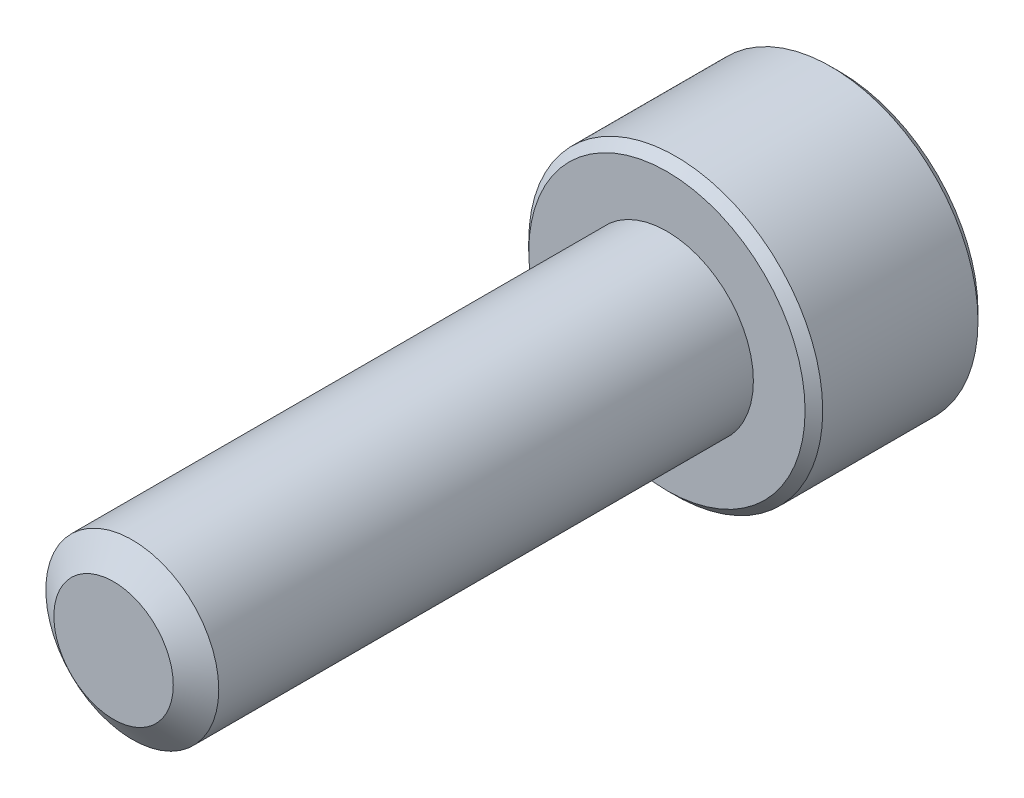
ISO-10303-21;
HEADER;
FILE_DESCRIPTION(('STEP AP214'),'2;1');
FILE_NAME('part.step','',(''),(''),'','','');
FILE_SCHEMA(('AUTOMOTIVE_DESIGN { 1 0 10303 214 1 1 1 1 }'));
ENDSEC;
DATA;
#1=APPLICATION_CONTEXT('core data for automotive mechanical design processes');
#2=APPLICATION_PROTOCOL_DEFINITION('international standard','automotive_design',2000,#1);
#3=PRODUCT_CONTEXT('',#1,'mechanical');
#4=PRODUCT('Part','Part','',(#3));
#5=PRODUCT_RELATED_PRODUCT_CATEGORY('part','',(#4));
#6=PRODUCT_DEFINITION_FORMATION('','',#4);
#7=PRODUCT_DEFINITION_CONTEXT('part definition',#1,'design');
#8=PRODUCT_DEFINITION('design','',#6,#7);
#9=PRODUCT_DEFINITION_SHAPE('','',#8);
#10=(LENGTH_UNIT() NAMED_UNIT(*) SI_UNIT(.MILLI.,.METRE.));
#11=(NAMED_UNIT(*) PLANE_ANGLE_UNIT() SI_UNIT($,.RADIAN.));
#12=(NAMED_UNIT(*) SI_UNIT($,.STERADIAN.) SOLID_ANGLE_UNIT());
#13=UNCERTAINTY_MEASURE_WITH_UNIT(LENGTH_MEASURE(1.E-05),#10,'distance_accuracy_value','');
#14=(GEOMETRIC_REPRESENTATION_CONTEXT(3) GLOBAL_UNCERTAINTY_ASSIGNED_CONTEXT((#13)) GLOBAL_UNIT_ASSIGNED_CONTEXT((#10,
#11,#12)) REPRESENTATION_CONTEXT('',''));
#15=CARTESIAN_POINT('',(0.,0.,0.));
#16=DIRECTION('',(0.,0.,1.));
#17=DIRECTION('',(1.,0.,0.));
#18=AXIS2_PLACEMENT_3D('',#15,#16,#17);
#19=CARTESIAN_POINT('',(0.,0.,-16.));
#20=DIRECTION('',(0.,0.,1.));
#21=DIRECTION('',(1.,0.,0.));
#22=AXIS2_PLACEMENT_3D('',#19,#20,#21);
#23=CYLINDRICAL_SURFACE('',#22,2.5);
#24=CARTESIAN_POINT('',(0.,0.,-0.541691224311848));
#25=DIRECTION('',(0.,0.,1.));
#26=DIRECTION('',(1.,0.,0.));
#27=AXIS2_PLACEMENT_3D('',#24,#25,#26);
#28=CIRCLE('',#27,2.5);
#29=CARTESIAN_POINT('',(2.5,0.,-0.541691224311848));
#30=VERTEX_POINT('',#29);
#31=EDGE_CURVE('E91',#30,#30,#28,.T.);
#32=ORIENTED_EDGE('',*,*,#31,.F.);
#33=EDGE_LOOP('',(#32));
#34=FACE_BOUND('',#33,.T.);
#35=CARTESIAN_POINT('',(0.,0.,-16.));
#36=DIRECTION('',(0.,0.,-1.));
#37=DIRECTION('',(-1.,0.,0.));
#38=AXIS2_PLACEMENT_3D('',#35,#36,#37);
#39=CIRCLE('',#38,2.5);
#40=CARTESIAN_POINT('',(-2.5,0.,-16.));
#41=VERTEX_POINT('',#40);
#42=EDGE_CURVE('E198',#41,#41,#39,.F.);
#43=ORIENTED_EDGE('',*,*,#42,.T.);
#44=EDGE_LOOP('',(#43));
#45=FACE_BOUND('',#44,.T.);
#46=ADVANCED_FACE('F17',(#34,#45),#23,.T.);
#47=CARTESIAN_POINT('',(0.,0.,0.));
#48=DIRECTION('',(0.,0.,-1.));
#49=DIRECTION('',(-1.,0.,0.));
#50=AXIS2_PLACEMENT_3D('',#47,#48,#49);
#51=CONICAL_SURFACE('',#50,1.72638475772933,0.959931088596884);
#52=ORIENTED_EDGE('',*,*,#31,.T.);
#53=EDGE_LOOP('',(#52));
#54=FACE_BOUND('',#53,.T.);
#55=CARTESIAN_POINT('',(0.,0.,0.));
#56=DIRECTION('',(0.,0.,1.));
#57=DIRECTION('',(1.,0.,0.));
#58=AXIS2_PLACEMENT_3D('',#55,#56,#57);
#59=CIRCLE('',#58,1.72638475772933);
#60=CARTESIAN_POINT('',(1.72638475772933,0.,0.));
#61=VERTEX_POINT('',#60);
#62=EDGE_CURVE('E196',#61,#61,#59,.T.);
#63=ORIENTED_EDGE('',*,*,#62,.F.);
#64=EDGE_LOOP('',(#63));
#65=FACE_BOUND('',#64,.T.);
#66=ADVANCED_FACE('F179',(#54,#65),#51,.T.);
#67=CARTESIAN_POINT('',(0.,0.,0.));
#68=DIRECTION('',(0.,0.,1.));
#69=DIRECTION('',(1.,0.,0.));
#70=AXIS2_PLACEMENT_3D('',#67,#68,#69);
#71=PLANE('',#70);
#72=ORIENTED_EDGE('',*,*,#62,.T.);
#73=EDGE_LOOP('',(#72));
#74=FACE_BOUND('',#73,.T.);
#75=ADVANCED_FACE('F176',(#74),#71,.T.);
#76=CARTESIAN_POINT('',(0.,0.,-21.));
#77=DIRECTION('',(0.,0.,1.));
#78=DIRECTION('',(1.,0.,0.));
#79=AXIS2_PLACEMENT_3D('',#76,#77,#78);
#80=CYLINDRICAL_SURFACE('',#79,4.25);
#81=CARTESIAN_POINT('',(0.,0.,-20.745));
#82=DIRECTION('',(0.,0.,-1.));
#83=DIRECTION('',(-1.,0.,0.));
#84=AXIS2_PLACEMENT_3D('',#81,#82,#83);
#85=CIRCLE('',#84,4.25);
#86=CARTESIAN_POINT('',(-4.25,0.,-20.745));
#87=VERTEX_POINT('',#86);
#88=EDGE_CURVE('E25',#87,#87,#85,.F.);
#89=ORIENTED_EDGE('',*,*,#88,.T.);
#90=EDGE_LOOP('',(#89));
#91=FACE_BOUND('',#90,.T.);
#92=CARTESIAN_POINT('',(0.,0.,-16.255));
#93=DIRECTION('',(0.,0.,-1.));
#94=DIRECTION('',(-1.,0.,0.));
#95=AXIS2_PLACEMENT_3D('',#92,#93,#94);
#96=CIRCLE('',#95,4.25);
#97=CARTESIAN_POINT('',(-4.25,0.,-16.255));
#98=VERTEX_POINT('',#97);
#99=EDGE_CURVE('E154',#98,#98,#96,.T.);
#100=ORIENTED_EDGE('',*,*,#99,.T.);
#101=EDGE_LOOP('',(#100));
#102=FACE_BOUND('',#101,.T.);
#103=ADVANCED_FACE('F159',(#91,#102),#80,.T.);
#104=CARTESIAN_POINT('',(0.,0.,-21.));
#105=DIRECTION('',(0.,0.,-1.));
#106=DIRECTION('',(-1.,0.,0.));
#107=AXIS2_PLACEMENT_3D('',#104,#105,#106);
#108=PLANE('',#107);
#109=CARTESIAN_POINT('',(0.,0.,-21.));
#110=DIRECTION('',(0.,0.,-1.));
#111=DIRECTION('',(-1.,0.,0.));
#112=AXIS2_PLACEMENT_3D('',#109,#110,#111);
#113=CIRCLE('',#112,3.995);
#114=CARTESIAN_POINT('',(-3.995,0.,-21.));
#115=VERTEX_POINT('',#114);
#116=EDGE_CURVE('E90',#115,#115,#113,.T.);
#117=ORIENTED_EDGE('',*,*,#116,.T.);
#118=EDGE_LOOP('',(#117));
#119=FACE_BOUND('',#118,.T.);
#120=CARTESIAN_POINT('',(0.,0.,-21.));
#121=DIRECTION('',(0.,0.,-1.));
#122=DIRECTION('',(-1.,0.,0.));
#123=AXIS2_PLACEMENT_3D('',#120,#121,#122);
#124=CIRCLE('',#123,2.3094010767585);
#125=CARTESIAN_POINT('',(-2.,1.15470053837925,-21.));
#126=VERTEX_POINT('',#125);
#127=CARTESIAN_POINT('',(0.,2.3094010767585,-21.));
#128=VERTEX_POINT('',#127);
#129=EDGE_CURVE('E71',#126,#128,#124,.T.);
#130=ORIENTED_EDGE('',*,*,#129,.F.);
#131=CARTESIAN_POINT('',(-2.,-1.15470053837925,-21.));
#132=VERTEX_POINT('',#131);
#133=EDGE_CURVE('E31',#132,#126,#124,.T.);
#134=ORIENTED_EDGE('',*,*,#133,.F.);
#135=CARTESIAN_POINT('',(0.,-2.3094010767585,-21.));
#136=VERTEX_POINT('',#135);
#137=EDGE_CURVE('E258',#136,#132,#124,.T.);
#138=ORIENTED_EDGE('',*,*,#137,.F.);
#139=CARTESIAN_POINT('',(2.,-1.15470053837925,-21.));
#140=VERTEX_POINT('',#139);
#141=EDGE_CURVE('E38',#140,#136,#124,.T.);
#142=ORIENTED_EDGE('',*,*,#141,.F.);
#143=CARTESIAN_POINT('',(2.,1.15470053837925,-21.));
#144=VERTEX_POINT('',#143);
#145=EDGE_CURVE('E112',#144,#140,#124,.T.);
#146=ORIENTED_EDGE('',*,*,#145,.F.);
#147=EDGE_CURVE('E80',#128,#144,#124,.T.);
#148=ORIENTED_EDGE('',*,*,#147,.F.);
#149=EDGE_LOOP('',(#130,#134,#138,#142,#146,#148));
#150=FACE_BOUND('',#149,.T.);
#151=ADVANCED_FACE('F111',(#119,#150),#108,.T.);
#152=CARTESIAN_POINT('',(0.,0.,-16.));
#153=DIRECTION('',(0.,0.,-1.));
#154=DIRECTION('',(-1.,0.,0.));
#155=AXIS2_PLACEMENT_3D('',#152,#153,#154);
#156=PLANE('',#155);
#157=CARTESIAN_POINT('',(0.,0.,-16.));
#158=DIRECTION('',(0.,0.,-1.));
#159=DIRECTION('',(-1.,0.,0.));
#160=AXIS2_PLACEMENT_3D('',#157,#158,#159);
#161=CIRCLE('',#160,3.995);
#162=CARTESIAN_POINT('',(-3.995,0.,-16.));
#163=VERTEX_POINT('',#162);
#164=EDGE_CURVE('E11',#163,#163,#161,.F.);
#165=ORIENTED_EDGE('',*,*,#164,.T.);
#166=EDGE_LOOP('',(#165));
#167=FACE_BOUND('',#166,.T.);
#168=ORIENTED_EDGE('',*,*,#42,.F.);
#169=EDGE_LOOP('',(#168));
#170=FACE_BOUND('',#169,.T.);
#171=ADVANCED_FACE('F168',(#167,#170),#156,.F.);
#172=CARTESIAN_POINT('',(0.,0.,-21.));
#173=DIRECTION('',(0.,0.,-1.));
#174=DIRECTION('',(-1.,0.,0.));
#175=AXIS2_PLACEMENT_3D('',#172,#173,#174);
#176=CONICAL_SURFACE('',#175,2.3094010767585,0.78539816339745);
#177=ORIENTED_EDGE('',*,*,#147,.T.);
#178=CARTESIAN_POINT('',(-0.000199999999999218,2.30951654681234,-21.0001154787137));
#179=CARTESIAN_POINT('',(0.0685530340307063,2.26982196410711,-20.9604530902256));
#180=CARTESIAN_POINT('',(0.138455742135513,2.22946361676572,-20.9231199822842));
#181=CARTESIAN_POINT('',(0.280995244550438,2.1471683966763,-20.8547636851361));
#182=CARTESIAN_POINT('',(0.353645597565359,2.10522369580642,-20.8237785337372));
#183=CARTESIAN_POINT('',(0.500141601053972,2.02064418875706,-20.7707002165441));
#184=CARTESIAN_POINT('',(0.573949935246294,1.97803092714269,-20.7484736271766));
#185=CARTESIAN_POINT('',(0.723191631835263,1.89186619344273,-20.7142288166751));
#186=CARTESIAN_POINT('',(0.798620433918151,1.84831735425552,-20.7021850291441));
#187=CARTESIAN_POINT('',(0.928615500671078,1.7732646674724,-20.6913185119056));
#188=CARTESIAN_POINT('',(0.983013783970108,1.74185780396625,-20.68970975361));
#189=CARTESIAN_POINT('',(1.09172145551969,1.67909540053412,-20.6924188775987));
#190=CARTESIAN_POINT('',(1.14603080592134,1.64773988246021,-20.696738837758));
#191=CARTESIAN_POINT('',(1.25413672758934,1.5853248994842,-20.7110595674099));
#192=CARTESIAN_POINT('',(1.30793265655479,1.55426580541469,-20.721066692762));
#193=CARTESIAN_POINT('',(1.41459426230557,1.49268469862228,-20.7462124302497));
#194=CARTESIAN_POINT('',(1.46746001007071,1.46216264491917,-20.7613506490422));
#195=CARTESIAN_POINT('',(1.60287973308984,1.38397803138049,-20.8062945034292));
#196=CARTESIAN_POINT('',(1.68459383484948,1.33680037273297,-20.8394888394258));
#197=CARTESIAN_POINT('',(1.8047470372578,1.26742988897853,-20.8955258231714));
#198=CARTESIAN_POINT('',(1.84434285210918,1.24456923461531,-20.9152147029469));
#199=CARTESIAN_POINT('',(1.92280095888787,1.19927142554652,-20.9563873183649));
#200=CARTESIAN_POINT('',(1.96166368359374,1.17683402097614,-20.9778699516512));
#201=CARTESIAN_POINT('',(2.0002,1.15458506832541,-21.0001154787137));
#202=B_SPLINE_CURVE_WITH_KNOTS('',3,(#178,#179,#180,#181,#182,#183,#184,#185,#186,#187,#188,
#189,#190,#191,#192,#193,#194,#195,#196,#197,#198,#199,#200,#201),.UNSPECIFIED.,.F.,.F.,(4,2,2,
2,2,2,2,2,2,2,2,4),(0.,0.266420613771064,0.534393751523387,0.798110374376912,1.06116288956936,
1.24939906803721,1.43770123566247,1.62621426093931,1.81471283831913,2.11415604834144,
2.2634717071779,2.41269626969771),.UNSPECIFIED.);
#203=EDGE_CURVE('E85',#128,#144,#202,.T.);
#204=ORIENTED_EDGE('',*,*,#203,.F.);
#205=EDGE_LOOP('',(#177,#204));
#206=FACE_BOUND('',#205,.T.);
#207=ADVANCED_FACE('F86',(#206),#176,.F.);
#208=ORIENTED_EDGE('',*,*,#145,.T.);
#209=CARTESIAN_POINT('',(2.,-2.30294417292923,-21.7407713550277));
#210=CARTESIAN_POINT('',(2.,-2.24687002663712,-21.698443273626));
#211=CARTESIAN_POINT('',(2.,-2.19048190536959,-21.6565251568643));
#212=CARTESIAN_POINT('',(2.,-2.07695390496424,-21.573690417861));
#213=CARTESIAN_POINT('',(2.,-2.01981384066454,-21.5327740496681));
#214=CARTESIAN_POINT('',(2.,-1.90424016804775,-21.4518334520186));
#215=CARTESIAN_POINT('',(2.,-1.84579996743909,-21.4118185915599));
#216=CARTESIAN_POINT('',(2.,-1.7279274546176,-21.3332889936643));
#217=CARTESIAN_POINT('',(2.,-1.66849521292323,-21.2947741502431));
#218=CARTESIAN_POINT('',(2.,-1.4816299571002,-21.1776406516043));
#219=CARTESIAN_POINT('',(2.,-1.35220318163536,-21.1021459017296));
#220=CARTESIAN_POINT('',(2.,-1.08689521592924,-20.9640493509944));
#221=CARTESIAN_POINT('',(2.,-0.951037763938189,-20.9014040859035));
#222=CARTESIAN_POINT('',(2.,-0.747111912259408,-20.8247635438751));
#223=CARTESIAN_POINT('',(2.,-0.682064034147876,-20.8027671799191));
#224=CARTESIAN_POINT('',(2.,-0.550398103294753,-20.7639966876601));
#225=CARTESIAN_POINT('',(2.,-0.483779942722476,-20.7472229191212));
#226=CARTESIAN_POINT('',(2.,-0.350484328847655,-20.7200482578844));
#227=CARTESIAN_POINT('',(2.,-0.283829489364786,-20.7095381767417));
#228=CARTESIAN_POINT('',(2.,-0.149806987139377,-20.6950960855449));
#229=CARTESIAN_POINT('',(2.,-0.0824394489341226,-20.6911629447331));
#230=CARTESIAN_POINT('',(2.,0.0499055622944889,-20.6901664769337));
#231=CARTESIAN_POINT('',(2.,0.114881285143171,-20.6928596448504));
#232=CARTESIAN_POINT('',(2.,0.24427592148276,-20.7044300704227));
#233=CARTESIAN_POINT('',(2.,0.308694780266753,-20.7133079288332));
#234=CARTESIAN_POINT('',(2.,0.437599788610704,-20.7369136592961));
#235=CARTESIAN_POINT('',(2.,0.502067428644594,-20.7517410834465));
#236=CARTESIAN_POINT('',(2.,0.629594322598305,-20.786457883628));
#237=CARTESIAN_POINT('',(2.,0.692653693883149,-20.8063468361063));
#238=CARTESIAN_POINT('',(2.,0.891187889210542,-20.8764469792562));
#239=CARTESIAN_POINT('',(2.,1.02383545707306,-20.9346418003215));
#240=CARTESIAN_POINT('',(2.,1.28290932150074,-21.0640305754596));
#241=CARTESIAN_POINT('',(2.,1.4093111258757,-21.1352712314148));
#242=CARTESIAN_POINT('',(2.,1.59200441438962,-21.2464419918747));
#243=CARTESIAN_POINT('',(2.,1.6502754902619,-21.2831821903374));
#244=CARTESIAN_POINT('',(2.,1.76581760389242,-21.3582145141838));
#245=CARTESIAN_POINT('',(2.,1.82308856543104,-21.396506757118));
#246=CARTESIAN_POINT('',(2.,1.93629654762083,-21.4740422640812));
#247=CARTESIAN_POINT('',(2.,1.99224062500538,-21.5132752761336));
#248=CARTESIAN_POINT('',(2.,2.10336424029899,-21.5927788307365));
#249=CARTESIAN_POINT('',(2.,2.15854398422467,-21.6330490850006));
#250=CARTESIAN_POINT('',(2.,2.21340370692658,-21.6737442381459));
#251=B_SPLINE_CURVE_WITH_KNOTS('',3,(#209,#210,#211,#212,#213,#214,#215,#216,#217,#218,#219,
#220,#221,#222,#223,#224,#225,#226,#227,#228,#229,#230,#231,#232,#233,#234,#235,#236,#237,#238,
#239,#240,#241,#242,#243,#244,#245,#246,#247,#248,#249,#250),.UNSPECIFIED.,.F.,.F.,(4,2,2,2,2,2,
2,2,2,2,2,2,2,2,2,2,2,2,2,2,4),(0.,0.210772731976891,0.42159837465859,0.634057554623492,
0.846501695870172,1.29562155455624,1.74319622821645,1.94902062110207,2.15485918928325,
2.35699582502635,2.5590977043214,2.75388435553556,2.94868993014815,3.14690093452585,
3.34509535789702,3.77838155837653,4.21325029921624,4.41989056685646,4.6265465146092,
4.83152377111288,5.03644465914084),.UNSPECIFIED.);
#252=EDGE_CURVE('E79',#144,#140,#251,.F.);
#253=ORIENTED_EDGE('',*,*,#252,.F.);
#254=EDGE_LOOP('',(#208,#253));
#255=FACE_BOUND('',#254,.T.);
#256=ADVANCED_FACE('F264',(#255),#176,.F.);
#257=ORIENTED_EDGE('',*,*,#141,.T.);
#258=CARTESIAN_POINT('',(2.0002,-1.15458506832541,-21.0001154787137));
#259=CARTESIAN_POINT('',(1.93144696596929,-1.19427965103065,-20.9604530902256));
#260=CARTESIAN_POINT('',(1.86154425786449,-1.23463799837204,-20.9231199822842));
#261=CARTESIAN_POINT('',(1.71900475544956,-1.31693321846145,-20.8547636851361));
#262=CARTESIAN_POINT('',(1.64635440243464,-1.35887791933134,-20.8237785337372));
#263=CARTESIAN_POINT('',(1.49985839894603,-1.44345742638069,-20.7707002165441));
#264=CARTESIAN_POINT('',(1.42605006475371,-1.48607068799507,-20.7484736271766));
#265=CARTESIAN_POINT('',(1.27680836816474,-1.57223542169503,-20.7142288166751));
#266=CARTESIAN_POINT('',(1.20137956608185,-1.61578426088223,-20.7021850291441));
#267=CARTESIAN_POINT('',(1.07138449932892,-1.69083694766536,-20.6913185119056));
#268=CARTESIAN_POINT('',(1.01698621602989,-1.72224381117151,-20.68970975361));
#269=CARTESIAN_POINT('',(0.908278544480308,-1.78500621460364,-20.6924188775987));
#270=CARTESIAN_POINT('',(0.853969194078662,-1.81636173267754,-20.696738837758));
#271=CARTESIAN_POINT('',(0.745863272410664,-1.87877671565355,-20.7110595674099));
#272=CARTESIAN_POINT('',(0.69206734344521,-1.90983580972306,-20.721066692762));
#273=CARTESIAN_POINT('',(0.585405737694428,-1.97141691651547,-20.7462124302497));
#274=CARTESIAN_POINT('',(0.532539989929289,-2.00193897021859,-20.7613506490422));
#275=CARTESIAN_POINT('',(0.397120266910157,-2.08012358375727,-20.8062945034292));
#276=CARTESIAN_POINT('',(0.315406165150522,-2.12730124240478,-20.8394888394258));
#277=CARTESIAN_POINT('',(0.195252962742197,-2.19667172615922,-20.8955258231714));
#278=CARTESIAN_POINT('',(0.155657147890822,-2.21953238052245,-20.9152147029469));
#279=CARTESIAN_POINT('',(0.0771990411121272,-2.26483018959124,-20.9563873183649));
#280=CARTESIAN_POINT('',(0.0383363164062592,-2.28726759416161,-20.9778699516512));
#281=CARTESIAN_POINT('',(-0.000199999999999639,-2.30951654681234,-21.0001154787137));
#282=B_SPLINE_CURVE_WITH_KNOTS('',3,(#258,#259,#260,#261,#262,#263,#264,#265,#266,#267,#268,
#269,#270,#271,#272,#273,#274,#275,#276,#277,#278,#279,#280,#281),.UNSPECIFIED.,.F.,.F.,(4,2,2,
2,2,2,2,2,2,2,2,4),(0.,0.266420613771064,0.534393751523389,0.798110374376914,1.06116288956936,
1.24939906803722,1.43770123566247,1.62621426093931,1.81471283831913,2.11415604834145,
2.26347170717791,2.41269626969771),.UNSPECIFIED.);
#283=EDGE_CURVE('E122',#140,#136,#282,.T.);
#284=ORIENTED_EDGE('',*,*,#283,.F.);
#285=EDGE_LOOP('',(#257,#284));
#286=FACE_BOUND('',#285,.T.);
#287=ADVANCED_FACE('F261',(#286),#176,.F.);
#288=ORIENTED_EDGE('',*,*,#137,.T.);
#289=CARTESIAN_POINT('',(0.000200000000000452,-2.30951654681234,-21.0001154787137));
#290=CARTESIAN_POINT('',(-0.0685530340307053,-2.26982196410711,-20.9604530902256));
#291=CARTESIAN_POINT('',(-0.138455742135511,-2.22946361676572,-20.9231199822842));
#292=CARTESIAN_POINT('',(-0.280995244550436,-2.1471683966763,-20.8547636851361));
#293=CARTESIAN_POINT('',(-0.353645597565357,-2.10522369580642,-20.8237785337372));
#294=CARTESIAN_POINT('',(-0.50014160105397,-2.02064418875706,-20.7707002165441));
#295=CARTESIAN_POINT('',(-0.573949935246293,-1.97803092714269,-20.7484736271766));
#296=CARTESIAN_POINT('',(-0.723191631835262,-1.89186619344273,-20.7142288166751));
#297=CARTESIAN_POINT('',(-0.79862043391815,-1.84831735425552,-20.7021850291441));
#298=CARTESIAN_POINT('',(-0.928615500671077,-1.7732646674724,-20.6913185119056));
#299=CARTESIAN_POINT('',(-0.983013783970106,-1.74185780396625,-20.68970975361));
#300=CARTESIAN_POINT('',(-1.09172145551969,-1.67909540053412,-20.6924188775987));
#301=CARTESIAN_POINT('',(-1.14603080592134,-1.64773988246022,-20.696738837758));
#302=CARTESIAN_POINT('',(-1.25413672758934,-1.5853248994842,-20.7110595674099));
#303=CARTESIAN_POINT('',(-1.30793265655479,-1.55426580541469,-20.721066692762));
#304=CARTESIAN_POINT('',(-1.41459426230557,-1.49268469862228,-20.7462124302497));
#305=CARTESIAN_POINT('',(-1.46746001007071,-1.46216264491917,-20.7613506490422));
#306=CARTESIAN_POINT('',(-1.60287973308984,-1.38397803138049,-20.8062945034292));
#307=CARTESIAN_POINT('',(-1.68459383484948,-1.33680037273297,-20.8394888394258));
#308=CARTESIAN_POINT('',(-1.8047470372578,-1.26742988897853,-20.8955258231714));
#309=CARTESIAN_POINT('',(-1.84434285210918,-1.24456923461531,-20.9152147029469));
#310=CARTESIAN_POINT('',(-1.92280095888787,-1.19927142554652,-20.9563873183649));
#311=CARTESIAN_POINT('',(-1.96166368359374,-1.17683402097614,-20.9778699516513));
#312=CARTESIAN_POINT('',(-2.0002,-1.15458506832541,-21.0001154787137));
#313=B_SPLINE_CURVE_WITH_KNOTS('',3,(#289,#290,#291,#292,#293,#294,#295,#296,#297,#298,#299,
#300,#301,#302,#303,#304,#305,#306,#307,#308,#309,#310,#311,#312),.UNSPECIFIED.,.F.,.F.,(4,2,2,
2,2,2,2,2,2,2,2,4),(0.,0.266420613771063,0.534393751523388,0.798110374376913,1.06116288956936,
1.24939906803721,1.43770123566247,1.62621426093931,1.81471283831913,2.11415604834145,
2.26347170717791,2.41269626969771),.UNSPECIFIED.);
#314=EDGE_CURVE('E235',#136,#132,#313,.T.);
#315=ORIENTED_EDGE('',*,*,#314,.F.);
#316=EDGE_LOOP('',(#288,#315));
#317=FACE_BOUND('',#316,.T.);
#318=ADVANCED_FACE('F260',(#317),#176,.F.);
#319=ORIENTED_EDGE('',*,*,#133,.T.);
#320=CARTESIAN_POINT('',(-2.,-2.3029441732643,-21.7407713552807));
#321=CARTESIAN_POINT('',(-2.,-2.24687002696278,-21.6984432738692));
#322=CARTESIAN_POINT('',(-2.,-2.19048190568582,-21.6565251570978));
#323=CARTESIAN_POINT('',(-2.,-2.07695390526152,-21.5736904180751));
#324=CARTESIAN_POINT('',(-2.,-2.01981384095229,-21.5327740498725));
#325=CARTESIAN_POINT('',(-2.,-1.90424016831614,-21.4518334522036));
#326=CARTESIAN_POINT('',(-2.,-1.84579996769763,-21.4118185917352));
#327=CARTESIAN_POINT('',(-2.,-1.72792745485625,-21.3332889938203));
#328=CARTESIAN_POINT('',(-2.,-1.66849521315186,-21.2947741503895));
#329=CARTESIAN_POINT('',(-2.,-1.48162995729573,-21.1776406517203));
#330=CARTESIAN_POINT('',(-2.,-1.35220318180736,-21.1021459018253));
#331=CARTESIAN_POINT('',(-2.,-1.08689521605219,-20.9640493510523));
#332=CARTESIAN_POINT('',(-2.,-0.951037764035626,-20.901404085944));
#333=CARTESIAN_POINT('',(-2.,-0.747111912337647,-20.8247635439028));
#334=CARTESIAN_POINT('',(-2.,-0.682064034234152,-20.8027671799472));
#335=CARTESIAN_POINT('',(-2.,-0.550398103397368,-20.7639966876876));
#336=CARTESIAN_POINT('',(-2.,-0.483779942833393,-20.7472229191476));
#337=CARTESIAN_POINT('',(-2.,-0.3504843289749,-20.7200482579067));
#338=CARTESIAN_POINT('',(-2.,-0.283829489500055,-20.709538176761));
#339=CARTESIAN_POINT('',(-2.,-0.149806987290425,-20.6950960855565));
#340=CARTESIAN_POINT('',(-2.,-0.0824394490929252,-20.6911629447399));
#341=CARTESIAN_POINT('',(-2.,0.0499055621213777,-20.6901664769296));
#342=CARTESIAN_POINT('',(-2.,0.114881284963487,-20.6928596448403));
#343=CARTESIAN_POINT('',(-2.,0.244275921290586,-20.7044300703996));
#344=CARTESIAN_POINT('',(-2.,0.308694780068663,-20.7133079288031));
#345=CARTESIAN_POINT('',(-2.,0.437599788400936,-20.7369136592514));
#346=CARTESIAN_POINT('',(-2.,0.502067428429081,-20.7517410833941));
#347=CARTESIAN_POINT('',(-2.,0.629594322371857,-20.78645788356));
#348=CARTESIAN_POINT('',(-2.,0.692653693651511,-20.8063468360305));
#349=CARTESIAN_POINT('',(-2.,0.891187888928466,-20.8764469791434));
#350=CARTESIAN_POINT('',(-2.,1.02383545674826,-20.9346418001747));
#351=CARTESIAN_POINT('',(-2.,1.28290932109378,-21.0640305752409));
#352=CARTESIAN_POINT('',(-2.,1.40931112542932,-21.1352712311583));
#353=CARTESIAN_POINT('',(-2.,1.59200441388854,-21.2464419915627));
#354=CARTESIAN_POINT('',(-2.,1.65027548974481,-21.2831821900083));
#355=CARTESIAN_POINT('',(-2.,1.76581760334354,-21.3582145138205));
#356=CARTESIAN_POINT('',(-2.,1.82308856486638,-21.3965067567377));
#357=CARTESIAN_POINT('',(-2.,1.936296547025,-21.4740422636668));
#358=CARTESIAN_POINT('',(-2.,1.99224062439414,-21.5132752757022));
#359=CARTESIAN_POINT('',(-2.,2.10336423965705,-21.5927788302713));
#360=CARTESIAN_POINT('',(-2.,2.15854398356743,-21.6330490845185));
#361=CARTESIAN_POINT('',(-2.,2.21340370625406,-21.673744237647));
#362=B_SPLINE_CURVE_WITH_KNOTS('',3,(#320,#321,#322,#323,#324,#325,#326,#327,#328,#329,#330,
#331,#332,#333,#334,#335,#336,#337,#338,#339,#340,#341,#342,#343,#344,#345,#346,#347,#348,#349,
#350,#351,#352,#353,#354,#355,#356,#357,#358,#359,#360,#361),.UNSPECIFIED.,.F.,.F.,(4,2,2,2,2,2,
2,2,2,2,2,2,2,2,2,2,2,2,2,2,4),(0.,0.210772732017009,0.421598374738837,0.634057554744619,
0.846501696032181,1.29562155480994,1.74319622856096,1.94902062142334,2.15485918958132,
2.35699582530216,2.55909770457495,2.75388435576874,2.94868993036093,3.14690093471669,
3.34509535806591,3.77838155838771,4.21325029906866,4.41989056664097,4.62654651432579,
4.83152377076248,5.03644465872344),.UNSPECIFIED.);
#363=EDGE_CURVE('E101',#132,#126,#362,.T.);
#364=ORIENTED_EDGE('',*,*,#363,.F.);
#365=EDGE_LOOP('',(#319,#364));
#366=FACE_BOUND('',#365,.T.);
#367=ADVANCED_FACE('F273',(#366),#176,.F.);
#368=ORIENTED_EDGE('',*,*,#129,.T.);
#369=CARTESIAN_POINT('',(-2.0002,1.15458506832541,-21.0001154787137));
#370=CARTESIAN_POINT('',(-1.93144696596929,1.19427965103065,-20.9604530902256));
#371=CARTESIAN_POINT('',(-1.86154425786449,1.23463799837204,-20.9231199822842));
#372=CARTESIAN_POINT('',(-1.71900475544956,1.31693321846145,-20.8547636851361));
#373=CARTESIAN_POINT('',(-1.64635440243464,1.35887791933134,-20.8237785337372));
#374=CARTESIAN_POINT('',(-1.49985839894603,1.44345742638069,-20.7707002165441));
#375=CARTESIAN_POINT('',(-1.42605006475371,1.48607068799507,-20.7484736271766));
#376=CARTESIAN_POINT('',(-1.27680836816474,1.57223542169503,-20.7142288166751));
#377=CARTESIAN_POINT('',(-1.20137956608185,1.61578426088223,-20.7021850291441));
#378=CARTESIAN_POINT('',(-1.07138449932892,1.69083694766536,-20.6913185119056));
#379=CARTESIAN_POINT('',(-1.01698621602989,1.72224381117151,-20.68970975361));
#380=CARTESIAN_POINT('',(-0.908278544480307,1.78500621460364,-20.6924188775987));
#381=CARTESIAN_POINT('',(-0.853969194078662,1.81636173267754,-20.696738837758));
#382=CARTESIAN_POINT('',(-0.745863272410663,1.87877671565355,-20.7110595674099));
#383=CARTESIAN_POINT('',(-0.692067343445209,1.90983580972306,-20.721066692762));
#384=CARTESIAN_POINT('',(-0.585405737694428,1.97141691651547,-20.7462124302497));
#385=CARTESIAN_POINT('',(-0.532539989929288,2.00193897021859,-20.7613506490422));
#386=CARTESIAN_POINT('',(-0.397120266910156,2.08012358375727,-20.8062945034292));
#387=CARTESIAN_POINT('',(-0.315406165150522,2.12730124240478,-20.8394888394258));
#388=CARTESIAN_POINT('',(-0.195252962742197,2.19667172615922,-20.8955258231714));
#389=CARTESIAN_POINT('',(-0.155657147890822,2.21953238052245,-20.9152147029469));
#390=CARTESIAN_POINT('',(-0.0771990411121274,2.26483018959124,-20.9563873183649));
#391=CARTESIAN_POINT('',(-0.0383363164062597,2.28726759416161,-20.9778699516512));
#392=CARTESIAN_POINT('',(0.000199999999999445,2.30951654681234,-21.0001154787137));
#393=B_SPLINE_CURVE_WITH_KNOTS('',3,(#369,#370,#371,#372,#373,#374,#375,#376,#377,#378,#379,
#380,#381,#382,#383,#384,#385,#386,#387,#388,#389,#390,#391,#392),.UNSPECIFIED.,.F.,.F.,(4,2,2,
2,2,2,2,2,2,2,2,4),(0.,0.266420613771064,0.534393751523389,0.798110374376914,1.06116288956936,
1.24939906803722,1.43770123566247,1.62621426093932,1.81471283831913,2.11415604834145,
2.26347170717791,2.41269626969771),.UNSPECIFIED.);
#394=EDGE_CURVE('E75',#126,#128,#393,.T.);
#395=ORIENTED_EDGE('',*,*,#394,.F.);
#396=EDGE_LOOP('',(#368,#395));
#397=FACE_BOUND('',#396,.T.);
#398=ADVANCED_FACE('F73',(#397),#176,.F.);
#399=CARTESIAN_POINT('',(2.,3.46410161513775,-18.));
#400=DIRECTION('',(0.,0.,-1.));
#401=DIRECTION('',(-1.,0.,0.));
#402=AXIS2_PLACEMENT_3D('',#399,#400,#401);
#403=PLANE('',#402);
#404=DIRECTION('',(0.866025403784439,0.5,0.));
#405=VECTOR('',#404,1.);
#406=CARTESIAN_POINT('',(-2.,1.15470053837925,-18.));
#407=LINE('',#406,#405);
#408=CARTESIAN_POINT('',(-2.,1.15470053837925,-18.));
#409=VERTEX_POINT('',#408);
#410=CARTESIAN_POINT('',(0.,2.3094010767585,-18.));
#411=VERTEX_POINT('',#410);
#412=EDGE_CURVE('E100',#409,#411,#407,.T.);
#413=ORIENTED_EDGE('',*,*,#412,.T.);
#414=DIRECTION('',(0.866025403784439,-0.5,0.));
#415=VECTOR('',#414,1.);
#416=CARTESIAN_POINT('',(0.,2.3094010767585,-18.));
#417=LINE('',#416,#415);
#418=CARTESIAN_POINT('',(2.,1.15470053837925,-18.));
#419=VERTEX_POINT('',#418);
#420=EDGE_CURVE('E105',#411,#419,#417,.T.);
#421=ORIENTED_EDGE('',*,*,#420,.T.);
#422=DIRECTION('',(0.,-1.,0.));
#423=VECTOR('',#422,1.);
#424=CARTESIAN_POINT('',(2.,1.15470053837925,-18.));
#425=LINE('',#424,#423);
#426=CARTESIAN_POINT('',(2.,-1.15470053837925,-18.));
#427=VERTEX_POINT('',#426);
#428=EDGE_CURVE('E221',#419,#427,#425,.T.);
#429=ORIENTED_EDGE('',*,*,#428,.T.);
#430=DIRECTION('',(-0.866025403784439,-0.5,0.));
#431=VECTOR('',#430,1.);
#432=CARTESIAN_POINT('',(2.,-1.15470053837925,-18.));
#433=LINE('',#432,#431);
#434=CARTESIAN_POINT('',(0.,-2.3094010767585,-18.));
#435=VERTEX_POINT('',#434);
#436=EDGE_CURVE('E218',#427,#435,#433,.T.);
#437=ORIENTED_EDGE('',*,*,#436,.T.);
#438=DIRECTION('',(-0.866025403784439,0.5,0.));
#439=VECTOR('',#438,1.);
#440=CARTESIAN_POINT('',(0.,-2.3094010767585,-18.));
#441=LINE('',#440,#439);
#442=CARTESIAN_POINT('',(-2.,-1.15470053837925,-18.));
#443=VERTEX_POINT('',#442);
#444=EDGE_CURVE('E215',#435,#443,#441,.T.);
#445=ORIENTED_EDGE('',*,*,#444,.T.);
#446=DIRECTION('',(0.,1.,0.));
#447=VECTOR('',#446,1.);
#448=CARTESIAN_POINT('',(-2.,-1.15470053837925,-18.));
#449=LINE('',#448,#447);
#450=EDGE_CURVE('E108',#443,#409,#449,.T.);
#451=ORIENTED_EDGE('',*,*,#450,.T.);
#452=EDGE_LOOP('',(#413,#421,#429,#437,#445,#451));
#453=FACE_BOUND('',#452,.T.);
#454=ADVANCED_FACE('F142',(#453),#403,.T.);
#455=CARTESIAN_POINT('',(0.,2.3094010767585,-18.));
#456=DIRECTION('',(0.5,0.866025403784439,0.));
#457=DIRECTION('',(-0.866025403784439,0.5,0.));
#458=AXIS2_PLACEMENT_3D('',#455,#456,#457);
#459=PLANE('',#458);
#460=DIRECTION('',(0.,0.,-1.));
#461=VECTOR('',#460,1.);
#462=CARTESIAN_POINT('',(0.,2.3094010767585,-18.));
#463=LINE('',#462,#461);
#464=EDGE_CURVE('E97',#411,#128,#463,.T.);
#465=ORIENTED_EDGE('',*,*,#464,.T.);
#466=ORIENTED_EDGE('',*,*,#203,.T.);
#467=DIRECTION('',(0.,0.,-1.));
#468=VECTOR('',#467,1.);
#469=CARTESIAN_POINT('',(2.,1.15470053837925,-18.));
#470=LINE('',#469,#468);
#471=EDGE_CURVE('E107',#419,#144,#470,.T.);
#472=ORIENTED_EDGE('',*,*,#471,.F.);
#473=ORIENTED_EDGE('',*,*,#420,.F.);
#474=EDGE_LOOP('',(#465,#466,#472,#473));
#475=FACE_BOUND('',#474,.T.);
#476=ADVANCED_FACE('F103',(#475),#459,.F.);
#477=CARTESIAN_POINT('',(2.,1.15470053837925,-18.));
#478=DIRECTION('',(1.,0.,0.));
#479=DIRECTION('',(0.,0.,-1.));
#480=AXIS2_PLACEMENT_3D('',#477,#478,#479);
#481=PLANE('',#480);
#482=ORIENTED_EDGE('',*,*,#471,.T.);
#483=ORIENTED_EDGE('',*,*,#252,.T.);
#484=DIRECTION('',(0.,0.,-1.));
#485=VECTOR('',#484,1.);
#486=CARTESIAN_POINT('',(2.,-1.15470053837925,-18.));
#487=LINE('',#486,#485);
#488=EDGE_CURVE('E204',#427,#140,#487,.T.);
#489=ORIENTED_EDGE('',*,*,#488,.F.);
#490=ORIENTED_EDGE('',*,*,#428,.F.);
#491=EDGE_LOOP('',(#482,#483,#489,#490));
#492=FACE_BOUND('',#491,.T.);
#493=ADVANCED_FACE('F131',(#492),#481,.F.);
#494=CARTESIAN_POINT('',(2.,-1.15470053837925,-18.));
#495=DIRECTION('',(0.5,-0.866025403784439,0.));
#496=DIRECTION('',(0.866025403784439,0.5,0.));
#497=AXIS2_PLACEMENT_3D('',#494,#495,#496);
#498=PLANE('',#497);
#499=ORIENTED_EDGE('',*,*,#488,.T.);
#500=ORIENTED_EDGE('',*,*,#283,.T.);
#501=DIRECTION('',(0.,0.,-1.));
#502=VECTOR('',#501,1.);
#503=CARTESIAN_POINT('',(0.,-2.3094010767585,-18.));
#504=LINE('',#503,#502);
#505=EDGE_CURVE('E207',#435,#136,#504,.T.);
#506=ORIENTED_EDGE('',*,*,#505,.F.);
#507=ORIENTED_EDGE('',*,*,#436,.F.);
#508=EDGE_LOOP('',(#499,#500,#506,#507));
#509=FACE_BOUND('',#508,.T.);
#510=ADVANCED_FACE('F135',(#509),#498,.F.);
#511=CARTESIAN_POINT('',(0.,-2.3094010767585,-18.));
#512=DIRECTION('',(-0.5,-0.866025403784439,0.));
#513=DIRECTION('',(0.866025403784439,-0.5,0.));
#514=AXIS2_PLACEMENT_3D('',#511,#512,#513);
#515=PLANE('',#514);
#516=ORIENTED_EDGE('',*,*,#505,.T.);
#517=ORIENTED_EDGE('',*,*,#314,.T.);
#518=DIRECTION('',(0.,0.,-1.));
#519=VECTOR('',#518,1.);
#520=CARTESIAN_POINT('',(-2.,-1.15470053837925,-18.));
#521=LINE('',#520,#519);
#522=EDGE_CURVE('E210',#443,#132,#521,.T.);
#523=ORIENTED_EDGE('',*,*,#522,.F.);
#524=ORIENTED_EDGE('',*,*,#444,.F.);
#525=EDGE_LOOP('',(#516,#517,#523,#524));
#526=FACE_BOUND('',#525,.T.);
#527=ADVANCED_FACE('F243',(#526),#515,.F.);
#528=CARTESIAN_POINT('',(-2.,-1.15470053837925,-18.));
#529=DIRECTION('',(-1.,0.,0.));
#530=DIRECTION('',(0.,-1.,0.));
#531=AXIS2_PLACEMENT_3D('',#528,#529,#530);
#532=PLANE('',#531);
#533=ORIENTED_EDGE('',*,*,#522,.T.);
#534=ORIENTED_EDGE('',*,*,#363,.T.);
#535=DIRECTION('',(0.,0.,-1.));
#536=VECTOR('',#535,1.);
#537=CARTESIAN_POINT('',(-2.,1.15470053837925,-18.));
#538=LINE('',#537,#536);
#539=EDGE_CURVE('E99',#409,#126,#538,.T.);
#540=ORIENTED_EDGE('',*,*,#539,.F.);
#541=ORIENTED_EDGE('',*,*,#450,.F.);
#542=EDGE_LOOP('',(#533,#534,#540,#541));
#543=FACE_BOUND('',#542,.T.);
#544=ADVANCED_FACE('F240',(#543),#532,.F.);
#545=CARTESIAN_POINT('',(-2.,1.15470053837925,-18.));
#546=DIRECTION('',(-0.5,0.866025403784439,0.));
#547=DIRECTION('',(-0.866025403784439,-0.5,0.));
#548=AXIS2_PLACEMENT_3D('',#545,#546,#547);
#549=PLANE('',#548);
#550=ORIENTED_EDGE('',*,*,#539,.T.);
#551=ORIENTED_EDGE('',*,*,#394,.T.);
#552=ORIENTED_EDGE('',*,*,#464,.F.);
#553=ORIENTED_EDGE('',*,*,#412,.F.);
#554=EDGE_LOOP('',(#550,#551,#552,#553));
#555=FACE_BOUND('',#554,.T.);
#556=ADVANCED_FACE('F95',(#555),#549,.F.);
#557=CARTESIAN_POINT('',(0.,0.,-21.));
#558=DIRECTION('',(0.,0.,1.));
#559=DIRECTION('',(1.,0.,0.));
#560=AXIS2_PLACEMENT_3D('',#557,#558,#559);
#561=CONICAL_SURFACE('',#560,3.995,0.785398163397448);
#562=ORIENTED_EDGE('',*,*,#88,.F.);
#563=EDGE_LOOP('',(#562));
#564=FACE_BOUND('',#563,.T.);
#565=ORIENTED_EDGE('',*,*,#116,.F.);
#566=EDGE_LOOP('',(#565));
#567=FACE_BOUND('',#566,.T.);
#568=ADVANCED_FACE('F162',(#564,#567),#561,.T.);
#569=CARTESIAN_POINT('',(0.,0.,-16.255));
#570=DIRECTION('',(0.,0.,-1.));
#571=DIRECTION('',(-1.,0.,0.));
#572=AXIS2_PLACEMENT_3D('',#569,#570,#571);
#573=CONICAL_SURFACE('',#572,4.25,0.785398163397445);
#574=ORIENTED_EDGE('',*,*,#164,.F.);
#575=EDGE_LOOP('',(#574));
#576=FACE_BOUND('',#575,.T.);
#577=ORIENTED_EDGE('',*,*,#99,.F.);
#578=EDGE_LOOP('',(#577));
#579=FACE_BOUND('',#578,.T.);
#580=ADVANCED_FACE('F19',(#576,#579),#573,.T.);
#581=CLOSED_SHELL('',(#46,#66,#75,#103,#151,#171,#207,#256,#287,#318,#367,#398,#454,#476,#493,
#510,#527,#544,#556,#568,#580));
#582=MANIFOLD_SOLID_BREP('B1',#581);
#583=ADVANCED_BREP_SHAPE_REPRESENTATION('',(#18,#582),#14);
#584=SHAPE_DEFINITION_REPRESENTATION(#9,#583);
ENDSEC;
END-ISO-10303-21;
